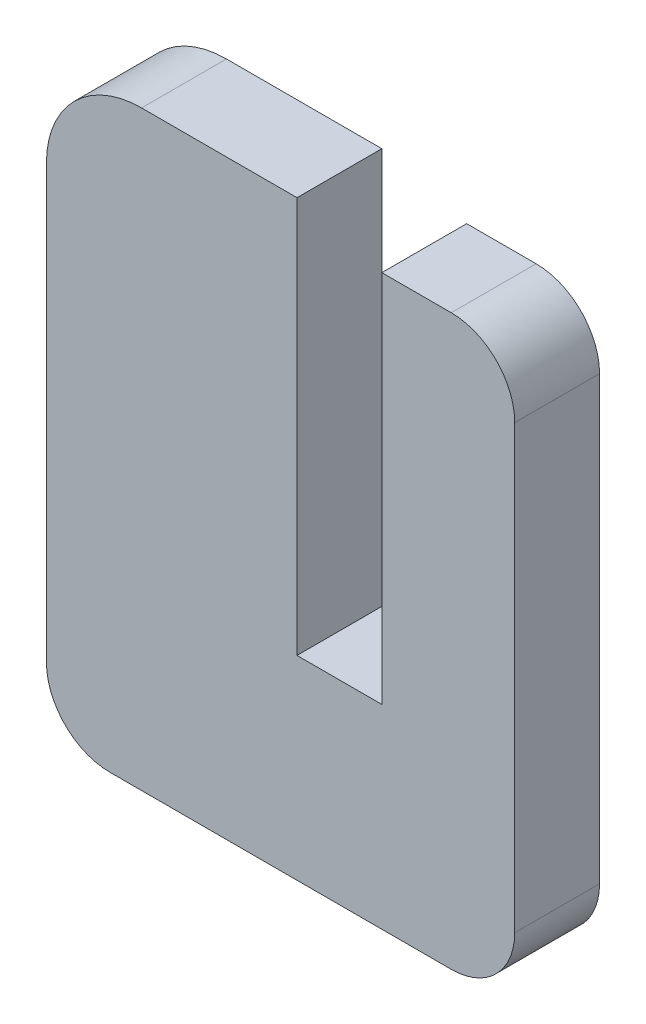
ISO-10303-21;
HEADER;
FILE_DESCRIPTION(('STEP AP214'),'2;1');
FILE_NAME('part.step','',(''),(''),'','','');
FILE_SCHEMA(('AUTOMOTIVE_DESIGN { 1 0 10303 214 1 1 1 1 }'));
ENDSEC;
DATA;
#1=APPLICATION_CONTEXT('core data for automotive mechanical design processes');
#2=APPLICATION_PROTOCOL_DEFINITION('international standard','automotive_design',2000,#1);
#3=PRODUCT_CONTEXT('',#1,'mechanical');
#4=PRODUCT('Part','Part','',(#3));
#5=PRODUCT_RELATED_PRODUCT_CATEGORY('part','',(#4));
#6=PRODUCT_DEFINITION_FORMATION('','',#4);
#7=PRODUCT_DEFINITION_CONTEXT('part definition',#1,'design');
#8=PRODUCT_DEFINITION('design','',#6,#7);
#9=PRODUCT_DEFINITION_SHAPE('','',#8);
#10=(LENGTH_UNIT() NAMED_UNIT(*) SI_UNIT(.MILLI.,.METRE.));
#11=(NAMED_UNIT(*) PLANE_ANGLE_UNIT() SI_UNIT($,.RADIAN.));
#12=(NAMED_UNIT(*) SI_UNIT($,.STERADIAN.) SOLID_ANGLE_UNIT());
#13=UNCERTAINTY_MEASURE_WITH_UNIT(LENGTH_MEASURE(1.E-05),#10,'distance_accuracy_value','');
#14=(GEOMETRIC_REPRESENTATION_CONTEXT(3) GLOBAL_UNCERTAINTY_ASSIGNED_CONTEXT((#13)) GLOBAL_UNIT_ASSIGNED_CONTEXT((#10,
#11,#12)) REPRESENTATION_CONTEXT('',''));
#15=CARTESIAN_POINT('',(0.,0.,0.));
#16=DIRECTION('',(0.,0.,1.));
#17=DIRECTION('',(1.,0.,0.));
#18=AXIS2_PLACEMENT_3D('',#15,#16,#17);
#19=CARTESIAN_POINT('',(1.035,37.28,5.35));
#20=DIRECTION('',(-1.,0.,0.));
#21=DIRECTION('',(0.,-1.,0.));
#22=AXIS2_PLACEMENT_3D('',#19,#20,#21);
#23=PLANE('',#22);
#24=DIRECTION('',(0.,1.,0.));
#25=VECTOR('',#24,1.);
#26=CARTESIAN_POINT('',(1.035,37.28,0.));
#27=LINE('',#26,#25);
#28=CARTESIAN_POINT('',(1.03500000000001,12.28,0.));
#29=VERTEX_POINT('',#28);
#30=CARTESIAN_POINT('',(1.035,37.28,0.));
#31=VERTEX_POINT('',#30);
#32=EDGE_CURVE('E152',#29,#31,#27,.T.);
#33=ORIENTED_EDGE('',*,*,#32,.T.);
#34=DIRECTION('',(0.,0.,-1.));
#35=VECTOR('',#34,1.);
#36=CARTESIAN_POINT('',(1.035,37.28,5.35));
#37=LINE('',#36,#35);
#38=CARTESIAN_POINT('',(1.035,37.28,5.35));
#39=VERTEX_POINT('',#38);
#40=EDGE_CURVE('E11',#39,#31,#37,.T.);
#41=ORIENTED_EDGE('',*,*,#40,.F.);
#42=DIRECTION('',(0.,1.,0.));
#43=VECTOR('',#42,1.);
#44=CARTESIAN_POINT('',(1.035,37.28,5.35));
#45=LINE('',#44,#43);
#46=CARTESIAN_POINT('',(1.03500000000001,12.28,5.35));
#47=VERTEX_POINT('',#46);
#48=EDGE_CURVE('E174',#47,#39,#45,.T.);
#49=ORIENTED_EDGE('',*,*,#48,.F.);
#50=DIRECTION('',(0.,0.,-1.));
#51=VECTOR('',#50,1.);
#52=CARTESIAN_POINT('',(1.03500000000001,12.28,5.35));
#53=LINE('',#52,#51);
#54=EDGE_CURVE('E148',#47,#29,#53,.T.);
#55=ORIENTED_EDGE('',*,*,#54,.T.);
#56=EDGE_LOOP('',(#33,#41,#49,#55));
#57=FACE_BOUND('',#56,.T.);
#58=ADVANCED_FACE('F32',(#57),#23,.F.);
#59=CARTESIAN_POINT('',(-8.765,37.28,5.35));
#60=DIRECTION('',(0.,-1.,0.));
#61=DIRECTION('',(0.,0.,-1.));
#62=AXIS2_PLACEMENT_3D('',#59,#60,#61);
#63=PLANE('',#62);
#64=DIRECTION('',(-1.,0.,0.));
#65=VECTOR('',#64,1.);
#66=CARTESIAN_POINT('',(-8.765,37.28,0.));
#67=LINE('',#66,#65);
#68=CARTESIAN_POINT('',(-8.765,37.28,0.));
#69=VERTEX_POINT('',#68);
#70=EDGE_CURVE('E155',#31,#69,#67,.T.);
#71=ORIENTED_EDGE('',*,*,#70,.T.);
#72=DIRECTION('',(0.,0.,-1.));
#73=VECTOR('',#72,1.);
#74=CARTESIAN_POINT('',(-8.765,37.28,5.35));
#75=LINE('',#74,#73);
#76=CARTESIAN_POINT('',(-8.765,37.28,5.35));
#77=VERTEX_POINT('',#76);
#78=EDGE_CURVE('E40',#77,#69,#75,.T.);
#79=ORIENTED_EDGE('',*,*,#78,.F.);
#80=DIRECTION('',(-1.,0.,0.));
#81=VECTOR('',#80,1.);
#82=CARTESIAN_POINT('',(-8.765,37.28,5.35));
#83=LINE('',#82,#81);
#84=EDGE_CURVE('E103',#39,#77,#83,.T.);
#85=ORIENTED_EDGE('',*,*,#84,.F.);
#86=ORIENTED_EDGE('',*,*,#40,.T.);
#87=EDGE_LOOP('',(#71,#79,#85,#86));
#88=FACE_BOUND('',#87,.T.);
#89=ADVANCED_FACE('F252',(#88),#63,.F.);
#90=CARTESIAN_POINT('',(-8.765,31.28,5.35));
#91=DIRECTION('',(0.,0.,-1.));
#92=DIRECTION('',(-1.,0.,0.));
#93=AXIS2_PLACEMENT_3D('',#90,#91,#92);
#94=CYLINDRICAL_SURFACE('',#93,6.);
#95=CARTESIAN_POINT('',(-8.765,31.28,0.));
#96=DIRECTION('',(0.,0.,1.));
#97=DIRECTION('',(1.,0.,0.));
#98=AXIS2_PLACEMENT_3D('',#95,#96,#97);
#99=CIRCLE('',#98,6.);
#100=CARTESIAN_POINT('',(-14.765,31.28,0.));
#101=VERTEX_POINT('',#100);
#102=EDGE_CURVE('E157',#69,#101,#99,.T.);
#103=ORIENTED_EDGE('',*,*,#102,.T.);
#104=DIRECTION('',(0.,0.,-1.));
#105=VECTOR('',#104,1.);
#106=CARTESIAN_POINT('',(-14.765,31.28,5.35));
#107=LINE('',#106,#105);
#108=CARTESIAN_POINT('',(-14.765,31.28,5.35));
#109=VERTEX_POINT('',#108);
#110=EDGE_CURVE('E193',#109,#101,#107,.T.);
#111=ORIENTED_EDGE('',*,*,#110,.F.);
#112=CARTESIAN_POINT('',(-8.765,31.28,5.35));
#113=DIRECTION('',(0.,0.,1.));
#114=DIRECTION('',(1.,0.,0.));
#115=AXIS2_PLACEMENT_3D('',#112,#113,#114);
#116=CIRCLE('',#115,6.);
#117=EDGE_CURVE('E201',#77,#109,#116,.T.);
#118=ORIENTED_EDGE('',*,*,#117,.F.);
#119=ORIENTED_EDGE('',*,*,#78,.T.);
#120=EDGE_LOOP('',(#103,#111,#118,#119));
#121=FACE_BOUND('',#120,.T.);
#122=ADVANCED_FACE('F199',(#121),#94,.T.);
#123=CARTESIAN_POINT('',(-14.765,4.,5.35));
#124=DIRECTION('',(1.,0.,0.));
#125=DIRECTION('',(0.,1.,0.));
#126=AXIS2_PLACEMENT_3D('',#123,#124,#125);
#127=PLANE('',#126);
#128=DIRECTION('',(0.,-1.,0.));
#129=VECTOR('',#128,1.);
#130=CARTESIAN_POINT('',(-14.765,4.,0.));
#131=LINE('',#130,#129);
#132=CARTESIAN_POINT('',(-14.765,4.,0.));
#133=VERTEX_POINT('',#132);
#134=EDGE_CURVE('E159',#101,#133,#131,.T.);
#135=ORIENTED_EDGE('',*,*,#134,.T.);
#136=DIRECTION('',(0.,0.,-1.));
#137=VECTOR('',#136,1.);
#138=CARTESIAN_POINT('',(-14.765,4.,5.35));
#139=LINE('',#138,#137);
#140=CARTESIAN_POINT('',(-14.765,4.,5.35));
#141=VERTEX_POINT('',#140);
#142=EDGE_CURVE('E190',#141,#133,#139,.T.);
#143=ORIENTED_EDGE('',*,*,#142,.F.);
#144=DIRECTION('',(0.,-1.,0.));
#145=VECTOR('',#144,1.);
#146=CARTESIAN_POINT('',(-14.765,4.,5.35));
#147=LINE('',#146,#145);
#148=EDGE_CURVE('E219',#109,#141,#147,.T.);
#149=ORIENTED_EDGE('',*,*,#148,.F.);
#150=ORIENTED_EDGE('',*,*,#110,.T.);
#151=EDGE_LOOP('',(#135,#143,#149,#150));
#152=FACE_BOUND('',#151,.T.);
#153=ADVANCED_FACE('F210',(#152),#127,.F.);
#154=CARTESIAN_POINT('',(-10.765,4.,5.35));
#155=DIRECTION('',(0.,0.,-1.));
#156=DIRECTION('',(-1.,0.,0.));
#157=AXIS2_PLACEMENT_3D('',#154,#155,#156);
#158=CYLINDRICAL_SURFACE('',#157,4.);
#159=CARTESIAN_POINT('',(-10.765,4.,0.));
#160=DIRECTION('',(0.,0.,1.));
#161=DIRECTION('',(1.,0.,0.));
#162=AXIS2_PLACEMENT_3D('',#159,#160,#161);
#163=CIRCLE('',#162,4.);
#164=CARTESIAN_POINT('',(-10.765,0.,0.));
#165=VERTEX_POINT('',#164);
#166=EDGE_CURVE('E161',#133,#165,#163,.T.);
#167=ORIENTED_EDGE('',*,*,#166,.T.);
#168=DIRECTION('',(0.,0.,-1.));
#169=VECTOR('',#168,1.);
#170=CARTESIAN_POINT('',(-10.765,0.,5.35));
#171=LINE('',#170,#169);
#172=CARTESIAN_POINT('',(-10.765,0.,5.35));
#173=VERTEX_POINT('',#172);
#174=EDGE_CURVE('E187',#173,#165,#171,.T.);
#175=ORIENTED_EDGE('',*,*,#174,.F.);
#176=CARTESIAN_POINT('',(-10.765,4.,5.35));
#177=DIRECTION('',(0.,0.,1.));
#178=DIRECTION('',(1.,0.,0.));
#179=AXIS2_PLACEMENT_3D('',#176,#177,#178);
#180=CIRCLE('',#179,4.);
#181=EDGE_CURVE('E216',#141,#173,#180,.T.);
#182=ORIENTED_EDGE('',*,*,#181,.F.);
#183=ORIENTED_EDGE('',*,*,#142,.T.);
#184=EDGE_LOOP('',(#167,#175,#182,#183));
#185=FACE_BOUND('',#184,.T.);
#186=ADVANCED_FACE('F214',(#185),#158,.T.);
#187=CARTESIAN_POINT('',(-10.765,0.,5.35));
#188=DIRECTION('',(0.,1.,0.));
#189=DIRECTION('',(-1.,0.,0.));
#190=AXIS2_PLACEMENT_3D('',#187,#188,#189);
#191=PLANE('',#190);
#192=DIRECTION('',(1.,0.,0.));
#193=VECTOR('',#192,1.);
#194=CARTESIAN_POINT('',(-10.765,0.,0.));
#195=LINE('',#194,#193);
#196=CARTESIAN_POINT('',(10.765,0.,0.));
#197=VERTEX_POINT('',#196);
#198=EDGE_CURVE('E163',#165,#197,#195,.T.);
#199=ORIENTED_EDGE('',*,*,#198,.T.);
#200=DIRECTION('',(0.,0.,-1.));
#201=VECTOR('',#200,1.);
#202=CARTESIAN_POINT('',(10.765,0.,5.35));
#203=LINE('',#202,#201);
#204=CARTESIAN_POINT('',(10.765,0.,5.35));
#205=VERTEX_POINT('',#204);
#206=EDGE_CURVE('E184',#205,#197,#203,.T.);
#207=ORIENTED_EDGE('',*,*,#206,.F.);
#208=DIRECTION('',(1.,0.,0.));
#209=VECTOR('',#208,1.);
#210=CARTESIAN_POINT('',(-10.765,0.,5.35));
#211=LINE('',#210,#209);
#212=EDGE_CURVE('E218',#173,#205,#211,.T.);
#213=ORIENTED_EDGE('',*,*,#212,.F.);
#214=ORIENTED_EDGE('',*,*,#174,.T.);
#215=EDGE_LOOP('',(#199,#207,#213,#214));
#216=FACE_BOUND('',#215,.T.);
#217=ADVANCED_FACE('F265',(#216),#191,.F.);
#218=CARTESIAN_POINT('',(10.765,4.,5.35));
#219=DIRECTION('',(0.,0.,-1.));
#220=DIRECTION('',(-1.,0.,0.));
#221=AXIS2_PLACEMENT_3D('',#218,#219,#220);
#222=CYLINDRICAL_SURFACE('',#221,4.);
#223=CARTESIAN_POINT('',(10.765,4.,0.));
#224=DIRECTION('',(0.,0.,1.));
#225=DIRECTION('',(1.,0.,0.));
#226=AXIS2_PLACEMENT_3D('',#223,#224,#225);
#227=CIRCLE('',#226,4.);
#228=CARTESIAN_POINT('',(14.765,4.,0.));
#229=VERTEX_POINT('',#228);
#230=EDGE_CURVE('E165',#197,#229,#227,.T.);
#231=ORIENTED_EDGE('',*,*,#230,.T.);
#232=DIRECTION('',(0.,0.,-1.));
#233=VECTOR('',#232,1.);
#234=CARTESIAN_POINT('',(14.765,4.,5.35));
#235=LINE('',#234,#233);
#236=CARTESIAN_POINT('',(14.765,4.,5.35));
#237=VERTEX_POINT('',#236);
#238=EDGE_CURVE('E181',#237,#229,#235,.T.);
#239=ORIENTED_EDGE('',*,*,#238,.F.);
#240=CARTESIAN_POINT('',(10.765,4.,5.35));
#241=DIRECTION('',(0.,0.,1.));
#242=DIRECTION('',(1.,0.,0.));
#243=AXIS2_PLACEMENT_3D('',#240,#241,#242);
#244=CIRCLE('',#243,4.);
#245=EDGE_CURVE('E221',#205,#237,#244,.T.);
#246=ORIENTED_EDGE('',*,*,#245,.F.);
#247=ORIENTED_EDGE('',*,*,#206,.T.);
#248=EDGE_LOOP('',(#231,#239,#246,#247));
#249=FACE_BOUND('',#248,.T.);
#250=ADVANCED_FACE('F268',(#249),#222,.T.);
#251=CARTESIAN_POINT('',(14.765,4.,5.35));
#252=DIRECTION('',(-1.,0.,0.));
#253=DIRECTION('',(0.,0.,1.));
#254=AXIS2_PLACEMENT_3D('',#251,#252,#253);
#255=PLANE('',#254);
#256=DIRECTION('',(0.,1.,0.));
#257=VECTOR('',#256,1.);
#258=CARTESIAN_POINT('',(14.765,4.,0.));
#259=LINE('',#258,#257);
#260=CARTESIAN_POINT('',(14.765,31.86,0.));
#261=VERTEX_POINT('',#260);
#262=EDGE_CURVE('E167',#229,#261,#259,.T.);
#263=ORIENTED_EDGE('',*,*,#262,.T.);
#264=DIRECTION('',(0.,0.,-1.));
#265=VECTOR('',#264,1.);
#266=CARTESIAN_POINT('',(14.765,31.86,5.35));
#267=LINE('',#266,#265);
#268=CARTESIAN_POINT('',(14.765,31.86,5.35));
#269=VERTEX_POINT('',#268);
#270=EDGE_CURVE('E178',#269,#261,#267,.T.);
#271=ORIENTED_EDGE('',*,*,#270,.F.);
#272=DIRECTION('',(0.,1.,0.));
#273=VECTOR('',#272,1.);
#274=CARTESIAN_POINT('',(14.765,4.,5.35));
#275=LINE('',#274,#273);
#276=EDGE_CURVE('E227',#237,#269,#275,.T.);
#277=ORIENTED_EDGE('',*,*,#276,.F.);
#278=ORIENTED_EDGE('',*,*,#238,.T.);
#279=EDGE_LOOP('',(#263,#271,#277,#278));
#280=FACE_BOUND('',#279,.T.);
#281=ADVANCED_FACE('F233',(#280),#255,.F.);
#282=CARTESIAN_POINT('',(10.765,31.86,5.35));
#283=DIRECTION('',(0.,0.,-1.));
#284=DIRECTION('',(-1.,0.,0.));
#285=AXIS2_PLACEMENT_3D('',#282,#283,#284);
#286=CYLINDRICAL_SURFACE('',#285,4.);
#287=CARTESIAN_POINT('',(10.765,31.86,0.));
#288=DIRECTION('',(0.,0.,1.));
#289=DIRECTION('',(1.,0.,0.));
#290=AXIS2_PLACEMENT_3D('',#287,#288,#289);
#291=CIRCLE('',#290,4.);
#292=CARTESIAN_POINT('',(10.765,35.86,0.));
#293=VERTEX_POINT('',#292);
#294=EDGE_CURVE('E169',#261,#293,#291,.T.);
#295=ORIENTED_EDGE('',*,*,#294,.T.);
#296=DIRECTION('',(0.,0.,-1.));
#297=VECTOR('',#296,1.);
#298=CARTESIAN_POINT('',(10.765,35.86,5.35));
#299=LINE('',#298,#297);
#300=CARTESIAN_POINT('',(10.765,35.86,5.35));
#301=VERTEX_POINT('',#300);
#302=EDGE_CURVE('E143',#301,#293,#299,.T.);
#303=ORIENTED_EDGE('',*,*,#302,.F.);
#304=CARTESIAN_POINT('',(10.765,31.86,5.35));
#305=DIRECTION('',(0.,0.,1.));
#306=DIRECTION('',(1.,0.,0.));
#307=AXIS2_PLACEMENT_3D('',#304,#305,#306);
#308=CIRCLE('',#307,4.);
#309=EDGE_CURVE('E134',#269,#301,#308,.T.);
#310=ORIENTED_EDGE('',*,*,#309,.F.);
#311=ORIENTED_EDGE('',*,*,#270,.T.);
#312=EDGE_LOOP('',(#295,#303,#310,#311));
#313=FACE_BOUND('',#312,.T.);
#314=ADVANCED_FACE('F237',(#313),#286,.T.);
#315=CARTESIAN_POINT('',(6.385,35.86,5.35));
#316=DIRECTION('',(0.,-1.,0.));
#317=DIRECTION('',(0.,0.,-1.));
#318=AXIS2_PLACEMENT_3D('',#315,#316,#317);
#319=PLANE('',#318);
#320=DIRECTION('',(-1.,0.,0.));
#321=VECTOR('',#320,1.);
#322=CARTESIAN_POINT('',(6.385,35.86,0.));
#323=LINE('',#322,#321);
#324=CARTESIAN_POINT('',(6.385,35.86,0.));
#325=VERTEX_POINT('',#324);
#326=EDGE_CURVE('E142',#293,#325,#323,.T.);
#327=ORIENTED_EDGE('',*,*,#326,.T.);
#328=DIRECTION('',(0.,0.,-1.));
#329=VECTOR('',#328,1.);
#330=CARTESIAN_POINT('',(6.385,35.86,5.35));
#331=LINE('',#330,#329);
#332=CARTESIAN_POINT('',(6.385,35.86,5.35));
#333=VERTEX_POINT('',#332);
#334=EDGE_CURVE('E139',#333,#325,#331,.T.);
#335=ORIENTED_EDGE('',*,*,#334,.F.);
#336=DIRECTION('',(-1.,0.,0.));
#337=VECTOR('',#336,1.);
#338=CARTESIAN_POINT('',(6.385,35.86,5.35));
#339=LINE('',#338,#337);
#340=EDGE_CURVE('E128',#301,#333,#339,.T.);
#341=ORIENTED_EDGE('',*,*,#340,.F.);
#342=ORIENTED_EDGE('',*,*,#302,.T.);
#343=EDGE_LOOP('',(#327,#335,#341,#342));
#344=FACE_BOUND('',#343,.T.);
#345=ADVANCED_FACE('F140',(#344),#319,.F.);
#346=CARTESIAN_POINT('',(6.385,35.86,5.35));
#347=DIRECTION('',(1.,0.,0.));
#348=DIRECTION('',(0.,1.,0.));
#349=AXIS2_PLACEMENT_3D('',#346,#347,#348);
#350=PLANE('',#349);
#351=DIRECTION('',(0.,-1.,0.));
#352=VECTOR('',#351,1.);
#353=CARTESIAN_POINT('',(6.385,35.86,0.));
#354=LINE('',#353,#352);
#355=CARTESIAN_POINT('',(6.38500000000001,12.28,0.));
#356=VERTEX_POINT('',#355);
#357=EDGE_CURVE('E89',#325,#356,#354,.T.);
#358=ORIENTED_EDGE('',*,*,#357,.T.);
#359=DIRECTION('',(0.,0.,-1.));
#360=VECTOR('',#359,1.);
#361=CARTESIAN_POINT('',(6.38500000000001,12.28,5.35));
#362=LINE('',#361,#360);
#363=CARTESIAN_POINT('',(6.38500000000001,12.28,5.35));
#364=VERTEX_POINT('',#363);
#365=EDGE_CURVE('E144',#364,#356,#362,.T.);
#366=ORIENTED_EDGE('',*,*,#365,.F.);
#367=DIRECTION('',(0.,-1.,0.));
#368=VECTOR('',#367,1.);
#369=CARTESIAN_POINT('',(6.385,35.86,5.35));
#370=LINE('',#369,#368);
#371=EDGE_CURVE('E132',#333,#364,#370,.T.);
#372=ORIENTED_EDGE('',*,*,#371,.F.);
#373=ORIENTED_EDGE('',*,*,#334,.T.);
#374=EDGE_LOOP('',(#358,#366,#372,#373));
#375=FACE_BOUND('',#374,.T.);
#376=ADVANCED_FACE('F146',(#375),#350,.F.);
#377=CARTESIAN_POINT('',(1.03500000000001,12.28,5.35));
#378=DIRECTION('',(0.,-1.,0.));
#379=DIRECTION('',(1.,0.,0.));
#380=AXIS2_PLACEMENT_3D('',#377,#378,#379);
#381=PLANE('',#380);
#382=DIRECTION('',(-1.,0.,0.));
#383=VECTOR('',#382,1.);
#384=CARTESIAN_POINT('',(1.03500000000001,12.28,0.));
#385=LINE('',#384,#383);
#386=EDGE_CURVE('E95',#356,#29,#385,.T.);
#387=ORIENTED_EDGE('',*,*,#386,.T.);
#388=ORIENTED_EDGE('',*,*,#54,.F.);
#389=DIRECTION('',(-1.,0.,0.));
#390=VECTOR('',#389,1.);
#391=CARTESIAN_POINT('',(1.03500000000001,12.28,5.35));
#392=LINE('',#391,#390);
#393=EDGE_CURVE('E48',#364,#47,#392,.T.);
#394=ORIENTED_EDGE('',*,*,#393,.F.);
#395=ORIENTED_EDGE('',*,*,#365,.T.);
#396=EDGE_LOOP('',(#387,#388,#394,#395));
#397=FACE_BOUND('',#396,.T.);
#398=ADVANCED_FACE('F241',(#397),#381,.F.);
#399=CARTESIAN_POINT('',(10.765,31.86,5.35));
#400=DIRECTION('',(0.,0.,1.));
#401=DIRECTION('',(1.,0.,0.));
#402=AXIS2_PLACEMENT_3D('',#399,#400,#401);
#403=PLANE('',#402);
#404=ORIENTED_EDGE('',*,*,#48,.T.);
#405=ORIENTED_EDGE('',*,*,#84,.T.);
#406=ORIENTED_EDGE('',*,*,#117,.T.);
#407=ORIENTED_EDGE('',*,*,#148,.T.);
#408=ORIENTED_EDGE('',*,*,#181,.T.);
#409=ORIENTED_EDGE('',*,*,#212,.T.);
#410=ORIENTED_EDGE('',*,*,#245,.T.);
#411=ORIENTED_EDGE('',*,*,#276,.T.);
#412=ORIENTED_EDGE('',*,*,#309,.T.);
#413=ORIENTED_EDGE('',*,*,#340,.T.);
#414=ORIENTED_EDGE('',*,*,#371,.T.);
#415=ORIENTED_EDGE('',*,*,#393,.T.);
#416=EDGE_LOOP('',(#404,#405,#406,#407,#408,#409,#410,#411,#412,#413,#414,#415));
#417=FACE_BOUND('',#416,.T.);
#418=ADVANCED_FACE('F130',(#417),#403,.T.);
#419=CARTESIAN_POINT('',(10.765,31.86,0.));
#420=DIRECTION('',(0.,0.,1.));
#421=DIRECTION('',(1.,0.,0.));
#422=AXIS2_PLACEMENT_3D('',#419,#420,#421);
#423=PLANE('',#422);
#424=ORIENTED_EDGE('',*,*,#32,.F.);
#425=ORIENTED_EDGE('',*,*,#386,.F.);
#426=ORIENTED_EDGE('',*,*,#357,.F.);
#427=ORIENTED_EDGE('',*,*,#326,.F.);
#428=ORIENTED_EDGE('',*,*,#294,.F.);
#429=ORIENTED_EDGE('',*,*,#262,.F.);
#430=ORIENTED_EDGE('',*,*,#230,.F.);
#431=ORIENTED_EDGE('',*,*,#198,.F.);
#432=ORIENTED_EDGE('',*,*,#166,.F.);
#433=ORIENTED_EDGE('',*,*,#134,.F.);
#434=ORIENTED_EDGE('',*,*,#102,.F.);
#435=ORIENTED_EDGE('',*,*,#70,.F.);
#436=EDGE_LOOP('',(#424,#425,#426,#427,#428,#429,#430,#431,#432,#433,#434,#435));
#437=FACE_BOUND('',#436,.T.);
#438=ADVANCED_FACE('F205',(#437),#423,.F.);
#439=CLOSED_SHELL('',(#58,#89,#122,#153,#186,#217,#250,#281,#314,#345,#376,#398,#418,#438));
#440=MANIFOLD_SOLID_BREP('B2',#439);
#441=ADVANCED_BREP_SHAPE_REPRESENTATION('',(#18,#440),#14);
#442=SHAPE_DEFINITION_REPRESENTATION(#9,#441);
ENDSEC;
END-ISO-10303-21;
